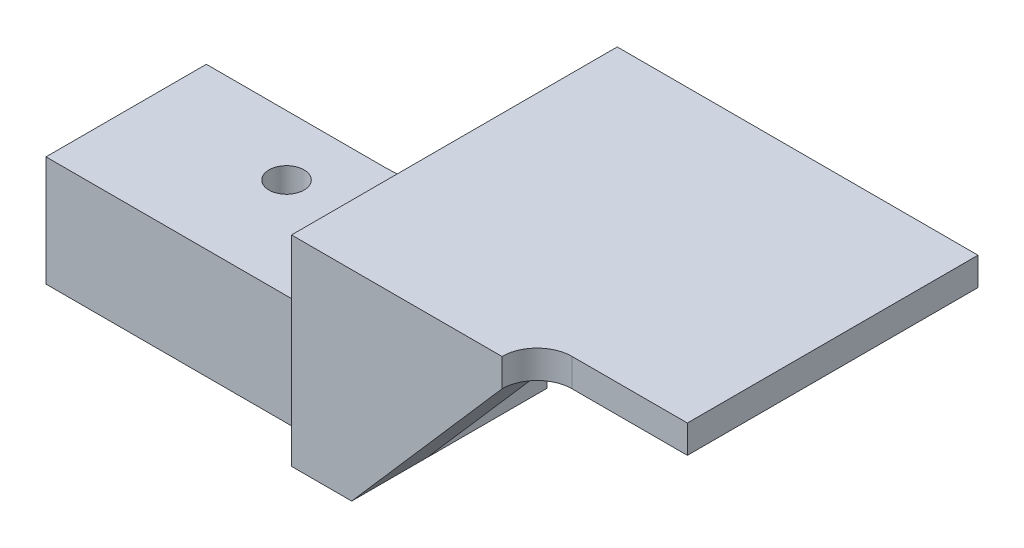
ISO-10303-21;
HEADER;
FILE_DESCRIPTION(('STEP AP214'),'2;1');
FILE_NAME('part.step','',(''),(''),'','','');
FILE_SCHEMA(('AUTOMOTIVE_DESIGN { 1 0 10303 214 1 1 1 1 }'));
ENDSEC;
DATA;
#1=APPLICATION_CONTEXT('core data for automotive mechanical design processes');
#2=APPLICATION_PROTOCOL_DEFINITION('international standard','automotive_design',2000,#1);
#3=PRODUCT_CONTEXT('',#1,'mechanical');
#4=PRODUCT('Part','Part','',(#3));
#5=PRODUCT_RELATED_PRODUCT_CATEGORY('part','',(#4));
#6=PRODUCT_DEFINITION_FORMATION('','',#4);
#7=PRODUCT_DEFINITION_CONTEXT('part definition',#1,'design');
#8=PRODUCT_DEFINITION('design','',#6,#7);
#9=PRODUCT_DEFINITION_SHAPE('','',#8);
#10=(LENGTH_UNIT() NAMED_UNIT(*) SI_UNIT(.MILLI.,.METRE.));
#11=(NAMED_UNIT(*) PLANE_ANGLE_UNIT() SI_UNIT($,.RADIAN.));
#12=(NAMED_UNIT(*) SI_UNIT($,.STERADIAN.) SOLID_ANGLE_UNIT());
#13=UNCERTAINTY_MEASURE_WITH_UNIT(LENGTH_MEASURE(1.E-05),#10,'distance_accuracy_value','');
#14=(GEOMETRIC_REPRESENTATION_CONTEXT(3) GLOBAL_UNCERTAINTY_ASSIGNED_CONTEXT((#13)) GLOBAL_UNIT_ASSIGNED_CONTEXT((#10,
#11,#12)) REPRESENTATION_CONTEXT('',''));
#15=CARTESIAN_POINT('',(0.,0.,0.));
#16=DIRECTION('',(0.,0.,1.));
#17=DIRECTION('',(1.,0.,0.));
#18=AXIS2_PLACEMENT_3D('',#15,#16,#17);
#19=CARTESIAN_POINT('',(34.,11.,0.));
#20=DIRECTION('',(-1.,0.,0.));
#21=DIRECTION('',(0.,0.,1.));
#22=AXIS2_PLACEMENT_3D('',#19,#20,#21);
#23=PLANE('',#22);
#24=DIRECTION('',(0.,1.,0.));
#25=VECTOR('',#24,1.);
#26=CARTESIAN_POINT('',(34.,17.2,12.));
#27=LINE('',#26,#25);
#28=CARTESIAN_POINT('',(34.,0.,12.));
#29=VERTEX_POINT('',#28);
#30=CARTESIAN_POINT('',(34.,3.89999999999999,12.));
#31=VERTEX_POINT('',#30);
#32=EDGE_CURVE('E453',#29,#31,#27,.T.);
#33=ORIENTED_EDGE('',*,*,#32,.F.);
#34=DIRECTION('',(0.,0.,-1.));
#35=VECTOR('',#34,1.);
#36=CARTESIAN_POINT('',(34.,0.,0.));
#37=LINE('',#36,#35);
#38=CARTESIAN_POINT('',(34.,0.,0.));
#39=VERTEX_POINT('',#38);
#40=EDGE_CURVE('E243',#29,#39,#37,.T.);
#41=ORIENTED_EDGE('',*,*,#40,.T.);
#42=DIRECTION('',(0.,-1.,0.));
#43=VECTOR('',#42,1.);
#44=CARTESIAN_POINT('',(34.,11.,0.));
#45=LINE('',#44,#43);
#46=CARTESIAN_POINT('',(34.,2.89999999999999,0.));
#47=VERTEX_POINT('',#46);
#48=EDGE_CURVE('E252',#47,#39,#45,.T.);
#49=ORIENTED_EDGE('',*,*,#48,.F.);
#50=CARTESIAN_POINT('',(34.,2.89999999999999,1.));
#51=DIRECTION('',(-1.,0.,0.));
#52=DIRECTION('',(0.,0.,1.));
#53=AXIS2_PLACEMENT_3D('',#50,#51,#52);
#54=CIRCLE('',#53,1.);
#55=CARTESIAN_POINT('',(34.,3.89999999999999,1.));
#56=VERTEX_POINT('',#55);
#57=EDGE_CURVE('E290',#47,#56,#54,.F.);
#58=ORIENTED_EDGE('',*,*,#57,.T.);
#59=DIRECTION('',(0.,0.,-1.));
#60=VECTOR('',#59,1.);
#61=CARTESIAN_POINT('',(34.,3.89999999999999,12.));
#62=LINE('',#61,#60);
#63=EDGE_CURVE('E224',#31,#56,#62,.T.);
#64=ORIENTED_EDGE('',*,*,#63,.F.);
#65=EDGE_LOOP('',(#33,#41,#49,#58,#64));
#66=FACE_BOUND('',#65,.T.);
#67=ADVANCED_FACE('F41',(#66),#23,.F.);
#68=CARTESIAN_POINT('',(64.,17.2,-13.));
#69=DIRECTION('',(0.,1.,0.));
#70=DIRECTION('',(0.,0.,1.));
#71=AXIS2_PLACEMENT_3D('',#68,#69,#70);
#72=PLANE('',#71);
#73=DIRECTION('',(0.,0.,1.));
#74=VECTOR('',#73,1.);
#75=CARTESIAN_POINT('',(49.,17.2,-13.));
#76=LINE('',#75,#74);
#77=CARTESIAN_POINT('',(49.,17.2,12.));
#78=VERTEX_POINT('',#77);
#79=CARTESIAN_POINT('',(49.,17.2,19.5));
#80=VERTEX_POINT('',#79);
#81=EDGE_CURVE('E11',#78,#80,#76,.T.);
#82=ORIENTED_EDGE('',*,*,#81,.F.);
#83=DIRECTION('',(1.,0.,0.));
#84=VECTOR('',#83,1.);
#85=CARTESIAN_POINT('',(49.,17.2,12.));
#86=LINE('',#85,#84);
#87=CARTESIAN_POINT('',(33.8,17.2,12.));
#88=VERTEX_POINT('',#87);
#89=EDGE_CURVE('E296',#88,#78,#86,.T.);
#90=ORIENTED_EDGE('',*,*,#89,.F.);
#91=DIRECTION('',(0.,0.,-1.));
#92=VECTOR('',#91,1.);
#93=CARTESIAN_POINT('',(33.8,17.2,12.));
#94=LINE('',#93,#92);
#95=CARTESIAN_POINT('',(33.8,17.2,-13.));
#96=VERTEX_POINT('',#95);
#97=EDGE_CURVE('E192',#88,#96,#94,.T.);
#98=ORIENTED_EDGE('',*,*,#97,.T.);
#99=DIRECTION('',(-1.,0.,0.));
#100=VECTOR('',#99,1.);
#101=CARTESIAN_POINT('',(64.,17.2,-13.));
#102=LINE('',#101,#100);
#103=CARTESIAN_POINT('',(64.,17.2,-13.));
#104=VERTEX_POINT('',#103);
#105=EDGE_CURVE('E343',#104,#96,#102,.T.);
#106=ORIENTED_EDGE('',*,*,#105,.F.);
#107=DIRECTION('',(0.,0.,-1.));
#108=VECTOR('',#107,1.);
#109=CARTESIAN_POINT('',(64.,17.2,-13.));
#110=LINE('',#109,#108);
#111=CARTESIAN_POINT('',(64.,17.2,16.));
#112=VERTEX_POINT('',#111);
#113=EDGE_CURVE('E341',#112,#104,#110,.T.);
#114=ORIENTED_EDGE('',*,*,#113,.F.);
#115=DIRECTION('',(-1.,0.,0.));
#116=VECTOR('',#115,1.);
#117=CARTESIAN_POINT('',(64.,17.2,16.));
#118=LINE('',#117,#116);
#119=CARTESIAN_POINT('',(52.5,17.2,16.));
#120=VERTEX_POINT('',#119);
#121=EDGE_CURVE('E315',#112,#120,#118,.T.);
#122=ORIENTED_EDGE('',*,*,#121,.T.);
#123=CARTESIAN_POINT('',(52.5,17.2,19.5));
#124=DIRECTION('',(0.,1.,0.));
#125=DIRECTION('',(0.,0.,1.));
#126=AXIS2_PLACEMENT_3D('',#123,#124,#125);
#127=CIRCLE('',#126,3.5);
#128=EDGE_CURVE('E49',#120,#80,#127,.T.);
#129=ORIENTED_EDGE('',*,*,#128,.T.);
#130=EDGE_LOOP('',(#82,#90,#98,#106,#114,#122,#129));
#131=FACE_BOUND('',#130,.T.);
#132=ADVANCED_FACE('F312',(#131),#72,.F.);
#133=CARTESIAN_POINT('',(0.,11.,16.));
#134=DIRECTION('',(0.,0.,-1.));
#135=DIRECTION('',(-1.,0.,0.));
#136=AXIS2_PLACEMENT_3D('',#133,#134,#135);
#137=PLANE('',#136);
#138=DIRECTION('',(1.,0.,0.));
#139=VECTOR('',#138,1.);
#140=CARTESIAN_POINT('',(0.,0.,16.));
#141=LINE('',#140,#139);
#142=CARTESIAN_POINT('',(0.,0.,16.));
#143=VERTEX_POINT('',#142);
#144=CARTESIAN_POINT('',(24.5,0.,16.));
#145=VERTEX_POINT('',#144);
#146=EDGE_CURVE('E240',#143,#145,#141,.T.);
#147=ORIENTED_EDGE('',*,*,#146,.T.);
#148=DIRECTION('',(0.,-1.,0.));
#149=VECTOR('',#148,1.);
#150=CARTESIAN_POINT('',(24.5,11.,16.));
#151=LINE('',#150,#149);
#152=CARTESIAN_POINT('',(24.5,11.,16.));
#153=VERTEX_POINT('',#152);
#154=EDGE_CURVE('E292',#145,#153,#151,.F.);
#155=ORIENTED_EDGE('',*,*,#154,.T.);
#156=DIRECTION('',(1.,0.,0.));
#157=VECTOR('',#156,1.);
#158=CARTESIAN_POINT('',(0.,11.,16.));
#159=LINE('',#158,#157);
#160=CARTESIAN_POINT('',(0.,11.,16.));
#161=VERTEX_POINT('',#160);
#162=EDGE_CURVE('E231',#161,#153,#159,.T.);
#163=ORIENTED_EDGE('',*,*,#162,.F.);
#164=DIRECTION('',(0.,-1.,0.));
#165=VECTOR('',#164,1.);
#166=CARTESIAN_POINT('',(0.,11.,16.));
#167=LINE('',#166,#165);
#168=EDGE_CURVE('E255',#161,#143,#167,.T.);
#169=ORIENTED_EDGE('',*,*,#168,.T.);
#170=EDGE_LOOP('',(#147,#155,#163,#169));
#171=FACE_BOUND('',#170,.T.);
#172=ADVANCED_FACE('F393',(#171),#137,.F.);
#173=DIRECTION('',(1.,0.,0.));
#174=VECTOR('',#173,1.);
#175=CARTESIAN_POINT('',(34.,20.,16.));
#176=LINE('',#175,#174);
#177=CARTESIAN_POINT('',(52.5,20.,16.));
#178=VERTEX_POINT('',#177);
#179=CARTESIAN_POINT('',(64.,20.,16.));
#180=VERTEX_POINT('',#179);
#181=EDGE_CURVE('E351',#178,#180,#176,.T.);
#182=ORIENTED_EDGE('',*,*,#181,.F.);
#183=DIRECTION('',(0.,1.,0.));
#184=VECTOR('',#183,1.);
#185=CARTESIAN_POINT('',(52.5,17.2,16.));
#186=LINE('',#185,#184);
#187=EDGE_CURVE('E306',#178,#120,#186,.F.);
#188=ORIENTED_EDGE('',*,*,#187,.T.);
#189=ORIENTED_EDGE('',*,*,#121,.F.);
#190=DIRECTION('',(0.,-1.,0.));
#191=VECTOR('',#190,1.);
#192=CARTESIAN_POINT('',(64.,20.,16.));
#193=LINE('',#192,#191);
#194=EDGE_CURVE('E339',#180,#112,#193,.T.);
#195=ORIENTED_EDGE('',*,*,#194,.F.);
#196=EDGE_LOOP('',(#182,#188,#189,#195));
#197=FACE_BOUND('',#196,.T.);
#198=ADVANCED_FACE('F402',(#197),#137,.F.);
#199=CARTESIAN_POINT('',(0.,11.,0.));
#200=DIRECTION('',(0.,0.,1.));
#201=DIRECTION('',(1.,0.,0.));
#202=AXIS2_PLACEMENT_3D('',#199,#200,#201);
#203=PLANE('',#202);
#204=DIRECTION('',(0.,1.,0.));
#205=VECTOR('',#204,1.);
#206=CARTESIAN_POINT('',(18.,7.1,0.));
#207=LINE('',#206,#205);
#208=CARTESIAN_POINT('',(18.,11.,0.));
#209=VERTEX_POINT('',#208);
#210=CARTESIAN_POINT('',(18.,8.1,0.));
#211=VERTEX_POINT('',#210);
#212=EDGE_CURVE('E260',#209,#211,#207,.F.);
#213=ORIENTED_EDGE('',*,*,#212,.T.);
#214=DIRECTION('',(1.,0.,0.));
#215=VECTOR('',#214,1.);
#216=CARTESIAN_POINT('',(0.,8.1,0.));
#217=LINE('',#216,#215);
#218=CARTESIAN_POINT('',(0.,8.1,0.));
#219=VERTEX_POINT('',#218);
#220=EDGE_CURVE('E279',#211,#219,#217,.F.);
#221=ORIENTED_EDGE('',*,*,#220,.T.);
#222=DIRECTION('',(0.,-1.,0.));
#223=VECTOR('',#222,1.);
#224=CARTESIAN_POINT('',(0.,11.,0.));
#225=LINE('',#224,#223);
#226=CARTESIAN_POINT('',(0.,11.,0.));
#227=VERTEX_POINT('',#226);
#228=EDGE_CURVE('E249',#227,#219,#225,.T.);
#229=ORIENTED_EDGE('',*,*,#228,.F.);
#230=DIRECTION('',(-1.,0.,0.));
#231=VECTOR('',#230,1.);
#232=CARTESIAN_POINT('',(0.,11.,0.));
#233=LINE('',#232,#231);
#234=EDGE_CURVE('E235',#209,#227,#233,.T.);
#235=ORIENTED_EDGE('',*,*,#234,.F.);
#236=EDGE_LOOP('',(#213,#221,#229,#235));
#237=FACE_BOUND('',#236,.T.);
#238=ADVANCED_FACE('F398',(#237),#203,.F.);
#239=CARTESIAN_POINT('',(0.,2.9,0.));
#240=VERTEX_POINT('',#239);
#241=CARTESIAN_POINT('',(0.,0.,0.));
#242=VERTEX_POINT('',#241);
#243=EDGE_CURVE('E237',#240,#242,#225,.T.);
#244=ORIENTED_EDGE('',*,*,#243,.F.);
#245=DIRECTION('',(-1.,0.,0.));
#246=VECTOR('',#245,1.);
#247=CARTESIAN_POINT('',(0.,2.9,0.));
#248=LINE('',#247,#246);
#249=EDGE_CURVE('E288',#240,#47,#248,.F.);
#250=ORIENTED_EDGE('',*,*,#249,.T.);
#251=ORIENTED_EDGE('',*,*,#48,.T.);
#252=DIRECTION('',(-1.,0.,0.));
#253=VECTOR('',#252,1.);
#254=CARTESIAN_POINT('',(0.,0.,0.));
#255=LINE('',#254,#253);
#256=EDGE_CURVE('E232',#39,#242,#255,.T.);
#257=ORIENTED_EDGE('',*,*,#256,.T.);
#258=EDGE_LOOP('',(#244,#250,#251,#257));
#259=FACE_BOUND('',#258,.T.);
#260=ADVANCED_FACE('F408',(#259),#203,.F.);
#261=CARTESIAN_POINT('',(0.,11.,0.));
#262=DIRECTION('',(1.,0.,0.));
#263=DIRECTION('',(0.,0.,-1.));
#264=AXIS2_PLACEMENT_3D('',#261,#262,#263);
#265=PLANE('',#264);
#266=ORIENTED_EDGE('',*,*,#228,.T.);
#267=CARTESIAN_POINT('',(0.,8.1,1.));
#268=DIRECTION('',(1.,0.,0.));
#269=DIRECTION('',(0.,0.,-1.));
#270=AXIS2_PLACEMENT_3D('',#267,#268,#269);
#271=CIRCLE('',#270,1.);
#272=CARTESIAN_POINT('',(0.,7.1,1.));
#273=VERTEX_POINT('',#272);
#274=EDGE_CURVE('E283',#219,#273,#271,.F.);
#275=ORIENTED_EDGE('',*,*,#274,.T.);
#276=DIRECTION('',(0.,0.,-1.));
#277=VECTOR('',#276,1.);
#278=CARTESIAN_POINT('',(0.,7.1,12.));
#279=LINE('',#278,#277);
#280=CARTESIAN_POINT('',(0.,7.1,12.));
#281=VERTEX_POINT('',#280);
#282=EDGE_CURVE('E214',#281,#273,#279,.T.);
#283=ORIENTED_EDGE('',*,*,#282,.F.);
#284=DIRECTION('',(0.,1.,0.));
#285=VECTOR('',#284,1.);
#286=CARTESIAN_POINT('',(0.,7.1,12.));
#287=LINE('',#286,#285);
#288=CARTESIAN_POINT('',(0.,3.9,12.));
#289=VERTEX_POINT('',#288);
#290=EDGE_CURVE('E210',#289,#281,#287,.T.);
#291=ORIENTED_EDGE('',*,*,#290,.F.);
#292=DIRECTION('',(0.,0.,-1.));
#293=VECTOR('',#292,1.);
#294=CARTESIAN_POINT('',(0.,3.9,12.));
#295=LINE('',#294,#293);
#296=CARTESIAN_POINT('',(0.,3.9,1.));
#297=VERTEX_POINT('',#296);
#298=EDGE_CURVE('E220',#289,#297,#295,.T.);
#299=ORIENTED_EDGE('',*,*,#298,.T.);
#300=CARTESIAN_POINT('',(0.,2.9,1.));
#301=DIRECTION('',(1.,0.,0.));
#302=DIRECTION('',(0.,0.,-1.));
#303=AXIS2_PLACEMENT_3D('',#300,#301,#302);
#304=CIRCLE('',#303,1.);
#305=EDGE_CURVE('E281',#297,#240,#304,.F.);
#306=ORIENTED_EDGE('',*,*,#305,.T.);
#307=ORIENTED_EDGE('',*,*,#243,.T.);
#308=DIRECTION('',(0.,0.,1.));
#309=VECTOR('',#308,1.);
#310=CARTESIAN_POINT('',(0.,0.,0.));
#311=LINE('',#310,#309);
#312=EDGE_CURVE('E223',#242,#143,#311,.T.);
#313=ORIENTED_EDGE('',*,*,#312,.T.);
#314=ORIENTED_EDGE('',*,*,#168,.F.);
#315=DIRECTION('',(0.,0.,1.));
#316=VECTOR('',#315,1.);
#317=CARTESIAN_POINT('',(0.,11.,0.));
#318=LINE('',#317,#316);
#319=EDGE_CURVE('E228',#227,#161,#318,.T.);
#320=ORIENTED_EDGE('',*,*,#319,.F.);
#321=EDGE_LOOP('',(#266,#275,#283,#291,#299,#306,#307,#313,#314,#320));
#322=FACE_BOUND('',#321,.T.);
#323=ADVANCED_FACE('F404',(#322),#265,.F.);
#324=CARTESIAN_POINT('',(0.,11.,0.));
#325=DIRECTION('',(0.,1.,0.));
#326=DIRECTION('',(0.,0.,1.));
#327=AXIS2_PLACEMENT_3D('',#324,#325,#326);
#328=PLANE('',#327);
#329=DIRECTION('',(0.,0.,1.));
#330=VECTOR('',#329,1.);
#331=CARTESIAN_POINT('',(28.,11.,-13.));
#332=LINE('',#331,#330);
#333=CARTESIAN_POINT('',(28.,11.,-10.));
#334=VERTEX_POINT('',#333);
#335=CARTESIAN_POINT('',(28.,11.,19.5));
#336=VERTEX_POINT('',#335);
#337=EDGE_CURVE('E265',#334,#336,#332,.T.);
#338=ORIENTED_EDGE('',*,*,#337,.F.);
#339=CARTESIAN_POINT('',(18.,11.,-10.));
#340=DIRECTION('',(0.,1.,0.));
#341=DIRECTION('',(0.,0.,1.));
#342=AXIS2_PLACEMENT_3D('',#339,#340,#341);
#343=CIRCLE('',#342,10.);
#344=EDGE_CURVE('E263',#334,#209,#343,.F.);
#345=ORIENTED_EDGE('',*,*,#344,.T.);
#346=ORIENTED_EDGE('',*,*,#234,.T.);
#347=ORIENTED_EDGE('',*,*,#319,.T.);
#348=ORIENTED_EDGE('',*,*,#162,.T.);
#349=CARTESIAN_POINT('',(24.5,11.,19.5));
#350=DIRECTION('',(0.,1.,0.));
#351=DIRECTION('',(0.,0.,1.));
#352=AXIS2_PLACEMENT_3D('',#349,#350,#351);
#353=CIRCLE('',#352,3.5);
#354=EDGE_CURVE('E303',#153,#336,#353,.F.);
#355=ORIENTED_EDGE('',*,*,#354,.T.);
#356=EDGE_LOOP('',(#338,#345,#346,#347,#348,#355));
#357=FACE_BOUND('',#356,.T.);
#358=CARTESIAN_POINT('',(14.,11.,6.));
#359=DIRECTION('',(0.,1.,0.));
#360=DIRECTION('',(0.,0.,1.));
#361=AXIS2_PLACEMENT_3D('',#358,#359,#360);
#362=CIRCLE('',#361,1.75000000000002);
#363=CARTESIAN_POINT('',(14.,11.,7.75000000000002));
#364=VERTEX_POINT('',#363);
#365=EDGE_CURVE('E357',#364,#364,#362,.T.);
#366=ORIENTED_EDGE('',*,*,#365,.F.);
#367=EDGE_LOOP('',(#366));
#368=FACE_BOUND('',#367,.T.);
#369=ADVANCED_FACE('F407',(#357,#368),#328,.T.);
#370=CARTESIAN_POINT('',(0.,0.,0.));
#371=DIRECTION('',(0.,1.,0.));
#372=DIRECTION('',(0.,0.,1.));
#373=AXIS2_PLACEMENT_3D('',#370,#371,#372);
#374=PLANE('',#373);
#375=CARTESIAN_POINT('',(14.,0.,6.));
#376=DIRECTION('',(0.,1.,0.));
#377=DIRECTION('',(0.,0.,1.));
#378=AXIS2_PLACEMENT_3D('',#375,#376,#377);
#379=CIRCLE('',#378,1.75000000000001);
#380=CARTESIAN_POINT('',(14.,0.,7.75000000000001));
#381=VERTEX_POINT('',#380);
#382=EDGE_CURVE('E360',#381,#381,#379,.T.);
#383=ORIENTED_EDGE('',*,*,#382,.T.);
#384=EDGE_LOOP('',(#383));
#385=FACE_BOUND('',#384,.T.);
#386=ORIENTED_EDGE('',*,*,#312,.F.);
#387=ORIENTED_EDGE('',*,*,#256,.F.);
#388=ORIENTED_EDGE('',*,*,#40,.F.);
#389=CARTESIAN_POINT('',(34.,0.,19.5));
#390=VERTEX_POINT('',#389);
#391=EDGE_CURVE('E244',#390,#29,#37,.T.);
#392=ORIENTED_EDGE('',*,*,#391,.F.);
#393=DIRECTION('',(1.,0.,0.));
#394=VECTOR('',#393,1.);
#395=CARTESIAN_POINT('',(0.,0.,19.5));
#396=LINE('',#395,#394);
#397=CARTESIAN_POINT('',(28.,0.,19.5));
#398=VERTEX_POINT('',#397);
#399=EDGE_CURVE('E330',#398,#390,#396,.T.);
#400=ORIENTED_EDGE('',*,*,#399,.F.);
#401=CARTESIAN_POINT('',(24.5,0.,19.5));
#402=DIRECTION('',(0.,1.,0.));
#403=DIRECTION('',(0.,0.,1.));
#404=AXIS2_PLACEMENT_3D('',#401,#402,#403);
#405=CIRCLE('',#404,3.5);
#406=EDGE_CURVE('E301',#398,#145,#405,.T.);
#407=ORIENTED_EDGE('',*,*,#406,.T.);
#408=ORIENTED_EDGE('',*,*,#146,.F.);
#409=EDGE_LOOP('',(#386,#387,#388,#392,#400,#407,#408));
#410=FACE_BOUND('',#409,.T.);
#411=ADVANCED_FACE('F467',(#385,#410),#374,.F.);
#412=CARTESIAN_POINT('',(0.,3.9,12.));
#413=DIRECTION('',(0.,-1.,0.));
#414=DIRECTION('',(1.,0.,0.));
#415=AXIS2_PLACEMENT_3D('',#412,#413,#414);
#416=PLANE('',#415);
#417=CARTESIAN_POINT('',(14.,3.9,6.));
#418=DIRECTION('',(0.,-1.,0.));
#419=DIRECTION('',(1.,0.,0.));
#420=AXIS2_PLACEMENT_3D('',#417,#418,#419);
#421=CIRCLE('',#420,1.75000000000001);
#422=CARTESIAN_POINT('',(15.75,3.9,6.));
#423=VERTEX_POINT('',#422);
#424=EDGE_CURVE('E363',#423,#423,#421,.T.);
#425=ORIENTED_EDGE('',*,*,#424,.T.);
#426=EDGE_LOOP('',(#425));
#427=FACE_BOUND('',#426,.T.);
#428=ORIENTED_EDGE('',*,*,#63,.T.);
#429=DIRECTION('',(-1.,0.,0.));
#430=VECTOR('',#429,1.);
#431=CARTESIAN_POINT('',(0.,3.9,1.));
#432=LINE('',#431,#430);
#433=EDGE_CURVE('E285',#56,#297,#432,.T.);
#434=ORIENTED_EDGE('',*,*,#433,.T.);
#435=ORIENTED_EDGE('',*,*,#298,.F.);
#436=DIRECTION('',(-1.,0.,0.));
#437=VECTOR('',#436,1.);
#438=CARTESIAN_POINT('',(0.,3.9,12.));
#439=LINE('',#438,#437);
#440=EDGE_CURVE('E212',#31,#289,#439,.T.);
#441=ORIENTED_EDGE('',*,*,#440,.F.);
#442=EDGE_LOOP('',(#428,#434,#435,#441));
#443=FACE_BOUND('',#442,.T.);
#444=ADVANCED_FACE('F474',(#427,#443),#416,.F.);
#445=CARTESIAN_POINT('',(0.,7.1,12.));
#446=DIRECTION('',(0.,1.,0.));
#447=DIRECTION('',(-1.,0.,0.));
#448=AXIS2_PLACEMENT_3D('',#445,#446,#447);
#449=PLANE('',#448);
#450=CARTESIAN_POINT('',(14.,7.1,6.));
#451=DIRECTION('',(0.,1.,0.));
#452=DIRECTION('',(-1.,0.,0.));
#453=AXIS2_PLACEMENT_3D('',#450,#451,#452);
#454=CIRCLE('',#453,1.75000000000001);
#455=CARTESIAN_POINT('',(12.25,7.1,6.));
#456=VERTEX_POINT('',#455);
#457=EDGE_CURVE('E216',#456,#456,#454,.T.);
#458=ORIENTED_EDGE('',*,*,#457,.T.);
#459=EDGE_LOOP('',(#458));
#460=FACE_BOUND('',#459,.T.);
#461=DIRECTION('',(-1.,0.,0.));
#462=VECTOR('',#461,1.);
#463=CARTESIAN_POINT('',(34.,7.1,-13.));
#464=LINE('',#463,#462);
#465=CARTESIAN_POINT('',(33.8,7.1,-13.));
#466=VERTEX_POINT('',#465);
#467=CARTESIAN_POINT('',(29.,7.1,-13.));
#468=VERTEX_POINT('',#467);
#469=EDGE_CURVE('E205',#466,#468,#464,.T.);
#470=ORIENTED_EDGE('',*,*,#469,.F.);
#471=DIRECTION('',(0.,0.,-1.));
#472=VECTOR('',#471,1.);
#473=CARTESIAN_POINT('',(33.8,7.1,12.));
#474=LINE('',#473,#472);
#475=CARTESIAN_POINT('',(33.8,7.1,12.));
#476=VERTEX_POINT('',#475);
#477=EDGE_CURVE('E56',#476,#466,#474,.T.);
#478=ORIENTED_EDGE('',*,*,#477,.F.);
#479=DIRECTION('',(1.,0.,0.));
#480=VECTOR('',#479,1.);
#481=CARTESIAN_POINT('',(0.,7.1,12.));
#482=LINE('',#481,#480);
#483=EDGE_CURVE('E202',#281,#476,#482,.T.);
#484=ORIENTED_EDGE('',*,*,#483,.F.);
#485=ORIENTED_EDGE('',*,*,#282,.T.);
#486=DIRECTION('',(1.,0.,0.));
#487=VECTOR('',#486,1.);
#488=CARTESIAN_POINT('',(0.,7.1,1.));
#489=LINE('',#488,#487);
#490=CARTESIAN_POINT('',(18.,7.1,1.));
#491=VERTEX_POINT('',#490);
#492=EDGE_CURVE('E269',#273,#491,#489,.T.);
#493=ORIENTED_EDGE('',*,*,#492,.T.);
#494=CARTESIAN_POINT('',(18.,7.1,-10.));
#495=DIRECTION('',(0.,1.,0.));
#496=DIRECTION('',(-1.,0.,0.));
#497=AXIS2_PLACEMENT_3D('',#494,#495,#496);
#498=CIRCLE('',#497,11.);
#499=CARTESIAN_POINT('',(29.,7.1,-10.));
#500=VERTEX_POINT('',#499);
#501=EDGE_CURVE('E271',#491,#500,#498,.T.);
#502=ORIENTED_EDGE('',*,*,#501,.T.);
#503=DIRECTION('',(0.,0.,1.));
#504=VECTOR('',#503,1.);
#505=CARTESIAN_POINT('',(29.,7.1,12.));
#506=LINE('',#505,#504);
#507=EDGE_CURVE('E273',#500,#468,#506,.F.);
#508=ORIENTED_EDGE('',*,*,#507,.T.);
#509=EDGE_LOOP('',(#470,#478,#484,#485,#493,#502,#508));
#510=FACE_BOUND('',#509,.T.);
#511=ADVANCED_FACE('F200',(#460,#510),#449,.F.);
#512=CARTESIAN_POINT('',(0.,0.,12.));
#513=DIRECTION('',(0.,0.,1.));
#514=DIRECTION('',(1.,0.,0.));
#515=AXIS2_PLACEMENT_3D('',#512,#513,#514);
#516=PLANE('',#515);
#517=DIRECTION('',(0.,1.,0.));
#518=VECTOR('',#517,1.);
#519=CARTESIAN_POINT('',(33.8,7.1,12.));
#520=LINE('',#519,#518);
#521=EDGE_CURVE('E189',#476,#88,#520,.T.);
#522=ORIENTED_EDGE('',*,*,#521,.T.);
#523=ORIENTED_EDGE('',*,*,#89,.T.);
#524=DIRECTION('',(-0.65726286253734,-0.753661415709483,0.));
#525=VECTOR('',#524,1.);
#526=CARTESIAN_POINT('',(34.,0.,12.));
#527=LINE('',#526,#525);
#528=EDGE_CURVE('E322',#78,#29,#527,.T.);
#529=ORIENTED_EDGE('',*,*,#528,.T.);
#530=ORIENTED_EDGE('',*,*,#32,.T.);
#531=ORIENTED_EDGE('',*,*,#440,.T.);
#532=ORIENTED_EDGE('',*,*,#290,.T.);
#533=ORIENTED_EDGE('',*,*,#483,.T.);
#534=EDGE_LOOP('',(#522,#523,#529,#530,#531,#532,#533));
#535=FACE_BOUND('',#534,.T.);
#536=ADVANCED_FACE('F207',(#535),#516,.F.);
#537=CARTESIAN_POINT('',(14.,11.,6.));
#538=DIRECTION('',(0.,1.,0.));
#539=DIRECTION('',(0.,0.,1.));
#540=AXIS2_PLACEMENT_3D('',#537,#538,#539);
#541=CYLINDRICAL_SURFACE('',#540,1.75000000000001);
#542=ORIENTED_EDGE('',*,*,#382,.F.);
#543=EDGE_LOOP('',(#542));
#544=FACE_BOUND('',#543,.T.);
#545=ORIENTED_EDGE('',*,*,#424,.F.);
#546=EDGE_LOOP('',(#545));
#547=FACE_BOUND('',#546,.T.);
#548=ADVANCED_FACE('F372',(#544,#547),#541,.F.);
#549=ORIENTED_EDGE('',*,*,#365,.T.);
#550=EDGE_LOOP('',(#549));
#551=FACE_BOUND('',#550,.T.);
#552=ORIENTED_EDGE('',*,*,#457,.F.);
#553=EDGE_LOOP('',(#552));
#554=FACE_BOUND('',#553,.T.);
#555=ADVANCED_FACE('F369',(#551,#554),#541,.F.);
#556=CARTESIAN_POINT('',(28.,11.,-13.));
#557=DIRECTION('',(1.,0.,0.));
#558=DIRECTION('',(0.,0.,-1.));
#559=AXIS2_PLACEMENT_3D('',#556,#557,#558);
#560=PLANE('',#559);
#561=ORIENTED_EDGE('',*,*,#337,.T.);
#562=DIRECTION('',(0.,-1.,0.));
#563=VECTOR('',#562,1.);
#564=CARTESIAN_POINT('',(28.,0.,19.5));
#565=LINE('',#564,#563);
#566=CARTESIAN_POINT('',(28.,20.,19.5));
#567=VERTEX_POINT('',#566);
#568=EDGE_CURVE('E447',#567,#336,#565,.T.);
#569=ORIENTED_EDGE('',*,*,#568,.F.);
#570=DIRECTION('',(0.,0.,1.));
#571=VECTOR('',#570,1.);
#572=CARTESIAN_POINT('',(28.,20.,-13.));
#573=LINE('',#572,#571);
#574=CARTESIAN_POINT('',(28.,20.,-13.));
#575=VERTEX_POINT('',#574);
#576=EDGE_CURVE('E349',#575,#567,#573,.T.);
#577=ORIENTED_EDGE('',*,*,#576,.F.);
#578=DIRECTION('',(0.,1.,0.));
#579=VECTOR('',#578,1.);
#580=CARTESIAN_POINT('',(28.,11.,-13.));
#581=LINE('',#580,#579);
#582=CARTESIAN_POINT('',(28.,8.1,-13.));
#583=VERTEX_POINT('',#582);
#584=EDGE_CURVE('E355',#583,#575,#581,.T.);
#585=ORIENTED_EDGE('',*,*,#584,.F.);
#586=DIRECTION('',(0.,0.,1.));
#587=VECTOR('',#586,1.);
#588=CARTESIAN_POINT('',(28.,8.1,-13.));
#589=LINE('',#588,#587);
#590=CARTESIAN_POINT('',(28.,8.09999999999999,-10.));
#591=VERTEX_POINT('',#590);
#592=EDGE_CURVE('E266',#583,#591,#589,.T.);
#593=ORIENTED_EDGE('',*,*,#592,.T.);
#594=DIRECTION('',(0.,1.,0.));
#595=VECTOR('',#594,1.);
#596=CARTESIAN_POINT('',(28.,11.,-10.));
#597=LINE('',#596,#595);
#598=EDGE_CURVE('E258',#591,#334,#597,.T.);
#599=ORIENTED_EDGE('',*,*,#598,.T.);
#600=EDGE_LOOP('',(#561,#569,#577,#585,#593,#599));
#601=FACE_BOUND('',#600,.T.);
#602=ADVANCED_FACE('F371',(#601),#560,.F.);
#603=CARTESIAN_POINT('',(0.,0.,-13.));
#604=DIRECTION('',(0.,0.,-1.));
#605=DIRECTION('',(-1.,0.,0.));
#606=AXIS2_PLACEMENT_3D('',#603,#604,#605);
#607=PLANE('',#606);
#608=ORIENTED_EDGE('',*,*,#105,.T.);
#609=DIRECTION('',(0.,1.,0.));
#610=VECTOR('',#609,1.);
#611=CARTESIAN_POINT('',(33.8,7.1,-13.));
#612=LINE('',#611,#610);
#613=EDGE_CURVE('E196',#466,#96,#612,.T.);
#614=ORIENTED_EDGE('',*,*,#613,.F.);
#615=ORIENTED_EDGE('',*,*,#469,.T.);
#616=CARTESIAN_POINT('',(29.,8.1,-13.));
#617=DIRECTION('',(0.,0.,-1.));
#618=DIRECTION('',(-1.,0.,0.));
#619=AXIS2_PLACEMENT_3D('',#616,#617,#618);
#620=CIRCLE('',#619,1.);
#621=EDGE_CURVE('E275',#468,#583,#620,.T.);
#622=ORIENTED_EDGE('',*,*,#621,.T.);
#623=ORIENTED_EDGE('',*,*,#584,.T.);
#624=DIRECTION('',(-1.,0.,0.));
#625=VECTOR('',#624,1.);
#626=CARTESIAN_POINT('',(34.,20.,-13.));
#627=LINE('',#626,#625);
#628=CARTESIAN_POINT('',(64.,20.,-13.));
#629=VERTEX_POINT('',#628);
#630=EDGE_CURVE('E346',#629,#575,#627,.T.);
#631=ORIENTED_EDGE('',*,*,#630,.F.);
#632=DIRECTION('',(0.,1.,0.));
#633=VECTOR('',#632,1.);
#634=CARTESIAN_POINT('',(64.,20.,-13.));
#635=LINE('',#634,#633);
#636=EDGE_CURVE('E328',#104,#629,#635,.T.);
#637=ORIENTED_EDGE('',*,*,#636,.F.);
#638=EDGE_LOOP('',(#608,#614,#615,#622,#623,#631,#637));
#639=FACE_BOUND('',#638,.T.);
#640=ADVANCED_FACE('F380',(#639),#607,.T.);
#641=CARTESIAN_POINT('',(18.,11.,-10.));
#642=DIRECTION('',(0.,-1.,0.));
#643=DIRECTION('',(0.,0.,-1.));
#644=AXIS2_PLACEMENT_3D('',#641,#642,#643);
#645=CYLINDRICAL_SURFACE('',#644,10.);
#646=ORIENTED_EDGE('',*,*,#598,.F.);
#647=CARTESIAN_POINT('',(18.,8.1,-10.));
#648=DIRECTION('',(0.,1.,0.));
#649=DIRECTION('',(-1.,0.,0.));
#650=AXIS2_PLACEMENT_3D('',#647,#648,#649);
#651=CIRCLE('',#650,10.);
#652=EDGE_CURVE('E277',#591,#211,#651,.F.);
#653=ORIENTED_EDGE('',*,*,#652,.T.);
#654=ORIENTED_EDGE('',*,*,#212,.F.);
#655=ORIENTED_EDGE('',*,*,#344,.F.);
#656=EDGE_LOOP('',(#646,#653,#654,#655));
#657=FACE_BOUND('',#656,.T.);
#658=ADVANCED_FACE('F410',(#657),#645,.F.);
#659=CARTESIAN_POINT('',(0.,20.,0.));
#660=DIRECTION('',(0.,-1.,0.));
#661=DIRECTION('',(0.,0.,-1.));
#662=AXIS2_PLACEMENT_3D('',#659,#660,#661);
#663=PLANE('',#662);
#664=ORIENTED_EDGE('',*,*,#576,.T.);
#665=DIRECTION('',(-1.,0.,0.));
#666=VECTOR('',#665,1.);
#667=CARTESIAN_POINT('',(0.,20.,19.5));
#668=LINE('',#667,#666);
#669=CARTESIAN_POINT('',(49.,20.,19.5));
#670=VERTEX_POINT('',#669);
#671=EDGE_CURVE('E326',#670,#567,#668,.T.);
#672=ORIENTED_EDGE('',*,*,#671,.F.);
#673=CARTESIAN_POINT('',(52.5,20.,19.5));
#674=DIRECTION('',(0.,-1.,0.));
#675=DIRECTION('',(0.,0.,-1.));
#676=AXIS2_PLACEMENT_3D('',#673,#674,#675);
#677=CIRCLE('',#676,3.5);
#678=EDGE_CURVE('E308',#670,#178,#677,.T.);
#679=ORIENTED_EDGE('',*,*,#678,.T.);
#680=ORIENTED_EDGE('',*,*,#181,.T.);
#681=DIRECTION('',(0.,0.,1.));
#682=VECTOR('',#681,1.);
#683=CARTESIAN_POINT('',(64.,20.,-13.));
#684=LINE('',#683,#682);
#685=EDGE_CURVE('E336',#629,#180,#684,.T.);
#686=ORIENTED_EDGE('',*,*,#685,.F.);
#687=ORIENTED_EDGE('',*,*,#630,.T.);
#688=EDGE_LOOP('',(#664,#672,#679,#680,#686,#687));
#689=FACE_BOUND('',#688,.T.);
#690=ADVANCED_FACE('F413',(#689),#663,.F.);
#691=CARTESIAN_POINT('',(64.,0.,0.));
#692=DIRECTION('',(-1.,0.,0.));
#693=DIRECTION('',(0.,0.,1.));
#694=AXIS2_PLACEMENT_3D('',#691,#692,#693);
#695=PLANE('',#694);
#696=ORIENTED_EDGE('',*,*,#636,.T.);
#697=ORIENTED_EDGE('',*,*,#685,.T.);
#698=ORIENTED_EDGE('',*,*,#194,.T.);
#699=ORIENTED_EDGE('',*,*,#113,.T.);
#700=EDGE_LOOP('',(#696,#697,#698,#699));
#701=FACE_BOUND('',#700,.T.);
#702=ADVANCED_FACE('F492',(#701),#695,.F.);
#703=CARTESIAN_POINT('',(19.3121880039935,-16.8420244220874,19.5));
#704=DIRECTION('',(-0.753661415709483,0.65726286253734,0.));
#705=DIRECTION('',(-0.65726286253734,-0.753661415709483,0.));
#706=AXIS2_PLACEMENT_3D('',#703,#704,#705);
#707=PLANE('',#706);
#708=DIRECTION('',(0.65726286253734,0.753661415709483,0.));
#709=VECTOR('',#708,1.);
#710=CARTESIAN_POINT('',(19.3121880039935,-16.8420244220874,19.5));
#711=LINE('',#710,#709);
#712=EDGE_CURVE('E64',#390,#80,#711,.T.);
#713=ORIENTED_EDGE('',*,*,#712,.F.);
#714=ORIENTED_EDGE('',*,*,#391,.T.);
#715=ORIENTED_EDGE('',*,*,#528,.F.);
#716=ORIENTED_EDGE('',*,*,#81,.T.);
#717=EDGE_LOOP('',(#713,#714,#715,#716));
#718=FACE_BOUND('',#717,.T.);
#719=ADVANCED_FACE('F321',(#718),#707,.F.);
#720=CARTESIAN_POINT('',(0.,0.,19.5));
#721=DIRECTION('',(0.,0.,1.));
#722=DIRECTION('',(1.,0.,0.));
#723=AXIS2_PLACEMENT_3D('',#720,#721,#722);
#724=PLANE('',#723);
#725=ORIENTED_EDGE('',*,*,#568,.T.);
#726=EDGE_CURVE('E299',#336,#398,#565,.T.);
#727=ORIENTED_EDGE('',*,*,#726,.T.);
#728=ORIENTED_EDGE('',*,*,#399,.T.);
#729=ORIENTED_EDGE('',*,*,#712,.T.);
#730=DIRECTION('',(0.,1.,0.));
#731=VECTOR('',#730,1.);
#732=CARTESIAN_POINT('',(49.,0.,19.5));
#733=LINE('',#732,#731);
#734=EDGE_CURVE('E323',#80,#670,#733,.T.);
#735=ORIENTED_EDGE('',*,*,#734,.T.);
#736=ORIENTED_EDGE('',*,*,#671,.T.);
#737=EDGE_LOOP('',(#725,#727,#728,#729,#735,#736));
#738=FACE_BOUND('',#737,.T.);
#739=ADVANCED_FACE('F427',(#738),#724,.T.);
#740=CARTESIAN_POINT('',(0.,8.1,1.));
#741=DIRECTION('',(1.,0.,0.));
#742=DIRECTION('',(0.,1.,0.));
#743=AXIS2_PLACEMENT_3D('',#740,#741,#742);
#744=CYLINDRICAL_SURFACE('',#743,1.);
#745=ORIENTED_EDGE('',*,*,#274,.F.);
#746=ORIENTED_EDGE('',*,*,#220,.F.);
#747=CARTESIAN_POINT('',(18.,8.1,1.));
#748=DIRECTION('',(1.,0.,0.));
#749=DIRECTION('',(0.,0.,-1.));
#750=AXIS2_PLACEMENT_3D('',#747,#748,#749);
#751=CIRCLE('',#750,1.);
#752=EDGE_CURVE('E295',#491,#211,#751,.T.);
#753=ORIENTED_EDGE('',*,*,#752,.F.);
#754=ORIENTED_EDGE('',*,*,#492,.F.);
#755=EDGE_LOOP('',(#745,#746,#753,#754));
#756=FACE_BOUND('',#755,.T.);
#757=ADVANCED_FACE('F423',(#756),#744,.T.);
#758=CARTESIAN_POINT('',(18.,8.1,-10.));
#759=DIRECTION('',(0.,1.,0.));
#760=DIRECTION('',(-1.,0.,0.));
#761=AXIS2_PLACEMENT_3D('',#758,#759,#760);
#762=TOROIDAL_SURFACE('',#761,11.,1.);
#763=ORIENTED_EDGE('',*,*,#752,.T.);
#764=ORIENTED_EDGE('',*,*,#652,.F.);
#765=CARTESIAN_POINT('',(29.,8.1,-10.));
#766=DIRECTION('',(0.,0.,-1.));
#767=DIRECTION('',(-1.,0.,0.));
#768=AXIS2_PLACEMENT_3D('',#765,#766,#767);
#769=CIRCLE('',#768,1.);
#770=EDGE_CURVE('E293',#500,#591,#769,.T.);
#771=ORIENTED_EDGE('',*,*,#770,.F.);
#772=ORIENTED_EDGE('',*,*,#501,.F.);
#773=EDGE_LOOP('',(#763,#764,#771,#772));
#774=FACE_BOUND('',#773,.T.);
#775=ADVANCED_FACE('F419',(#774),#762,.T.);
#776=CARTESIAN_POINT('',(29.,8.1,-13.));
#777=DIRECTION('',(0.,0.,1.));
#778=DIRECTION('',(1.,0.,0.));
#779=AXIS2_PLACEMENT_3D('',#776,#777,#778);
#780=CYLINDRICAL_SURFACE('',#779,1.);
#781=ORIENTED_EDGE('',*,*,#621,.F.);
#782=ORIENTED_EDGE('',*,*,#507,.F.);
#783=ORIENTED_EDGE('',*,*,#770,.T.);
#784=ORIENTED_EDGE('',*,*,#592,.F.);
#785=EDGE_LOOP('',(#781,#782,#783,#784));
#786=FACE_BOUND('',#785,.T.);
#787=ADVANCED_FACE('F415',(#786),#780,.T.);
#788=CARTESIAN_POINT('',(0.,2.9,1.));
#789=DIRECTION('',(-1.,0.,0.));
#790=DIRECTION('',(0.,-1.,0.));
#791=AXIS2_PLACEMENT_3D('',#788,#789,#790);
#792=CYLINDRICAL_SURFACE('',#791,1.);
#793=ORIENTED_EDGE('',*,*,#57,.F.);
#794=ORIENTED_EDGE('',*,*,#249,.F.);
#795=ORIENTED_EDGE('',*,*,#305,.F.);
#796=ORIENTED_EDGE('',*,*,#433,.F.);
#797=EDGE_LOOP('',(#793,#794,#795,#796));
#798=FACE_BOUND('',#797,.T.);
#799=ADVANCED_FACE('F418',(#798),#792,.T.);
#800=CARTESIAN_POINT('',(24.5,11.,19.5));
#801=DIRECTION('',(0.,1.,0.));
#802=DIRECTION('',(0.,0.,1.));
#803=AXIS2_PLACEMENT_3D('',#800,#801,#802);
#804=CYLINDRICAL_SURFACE('',#803,3.5);
#805=ORIENTED_EDGE('',*,*,#354,.F.);
#806=ORIENTED_EDGE('',*,*,#154,.F.);
#807=ORIENTED_EDGE('',*,*,#406,.F.);
#808=ORIENTED_EDGE('',*,*,#726,.F.);
#809=EDGE_LOOP('',(#805,#806,#807,#808));
#810=FACE_BOUND('',#809,.T.);
#811=ADVANCED_FACE('F430',(#810),#804,.F.);
#812=CARTESIAN_POINT('',(52.5,0.,19.5));
#813=DIRECTION('',(0.,-1.,0.));
#814=DIRECTION('',(0.,0.,-1.));
#815=AXIS2_PLACEMENT_3D('',#812,#813,#814);
#816=CYLINDRICAL_SURFACE('',#815,3.5);
#817=ORIENTED_EDGE('',*,*,#128,.F.);
#818=ORIENTED_EDGE('',*,*,#187,.F.);
#819=ORIENTED_EDGE('',*,*,#678,.F.);
#820=ORIENTED_EDGE('',*,*,#734,.F.);
#821=EDGE_LOOP('',(#817,#818,#819,#820));
#822=FACE_BOUND('',#821,.T.);
#823=ADVANCED_FACE('F43',(#822),#816,.F.);
#824=CARTESIAN_POINT('',(33.8,7.1,12.));
#825=DIRECTION('',(-1.,0.,0.));
#826=DIRECTION('',(0.,0.,1.));
#827=AXIS2_PLACEMENT_3D('',#824,#825,#826);
#828=PLANE('',#827);
#829=ORIENTED_EDGE('',*,*,#613,.T.);
#830=ORIENTED_EDGE('',*,*,#97,.F.);
#831=ORIENTED_EDGE('',*,*,#521,.F.);
#832=ORIENTED_EDGE('',*,*,#477,.T.);
#833=EDGE_LOOP('',(#829,#830,#831,#832));
#834=FACE_BOUND('',#833,.T.);
#835=ADVANCED_FACE('F190',(#834),#828,.F.);
#836=CLOSED_SHELL('',(#67,#132,#172,#198,#238,#260,#323,#369,#411,#444,#511,#536,#548,#555,#602,
#640,#658,#690,#702,#719,#739,#757,#775,#787,#799,#811,#823,#835));
#837=MANIFOLD_SOLID_BREP('B2',#836);
#838=ADVANCED_BREP_SHAPE_REPRESENTATION('',(#18,#837),#14);
#839=SHAPE_DEFINITION_REPRESENTATION(#9,#838);
ENDSEC;
END-ISO-10303-21;
